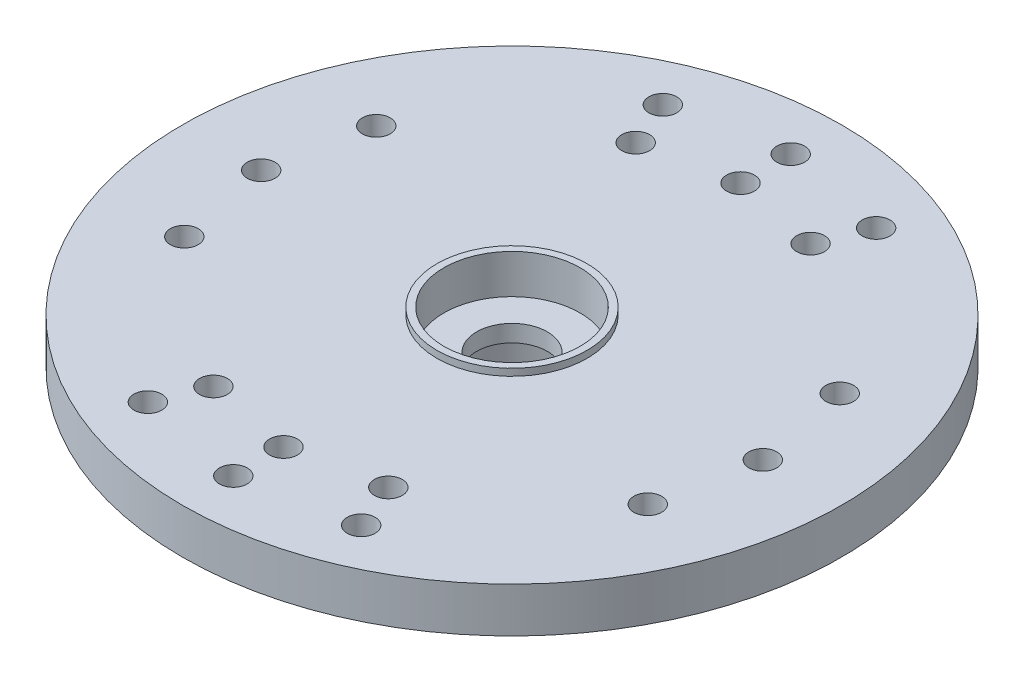
ISO-10303-21;
HEADER;
FILE_DESCRIPTION(('STEP AP214'),'2;1');
FILE_NAME('part.step','',(''),(''),'','','');
FILE_SCHEMA(('AUTOMOTIVE_DESIGN { 1 0 10303 214 1 1 1 1 }'));
ENDSEC;
DATA;
#1=APPLICATION_CONTEXT('core data for automotive mechanical design processes');
#2=APPLICATION_PROTOCOL_DEFINITION('international standard','automotive_design',2000,#1);
#3=PRODUCT_CONTEXT('',#1,'mechanical');
#4=PRODUCT('Part','Part','',(#3));
#5=PRODUCT_RELATED_PRODUCT_CATEGORY('part','',(#4));
#6=PRODUCT_DEFINITION_FORMATION('','',#4);
#7=PRODUCT_DEFINITION_CONTEXT('part definition',#1,'design');
#8=PRODUCT_DEFINITION('design','',#6,#7);
#9=PRODUCT_DEFINITION_SHAPE('','',#8);
#10=(LENGTH_UNIT() NAMED_UNIT(*) SI_UNIT(.MILLI.,.METRE.));
#11=(NAMED_UNIT(*) PLANE_ANGLE_UNIT() SI_UNIT($,.RADIAN.));
#12=(NAMED_UNIT(*) SI_UNIT($,.STERADIAN.) SOLID_ANGLE_UNIT());
#13=UNCERTAINTY_MEASURE_WITH_UNIT(LENGTH_MEASURE(1.E-05),#10,'distance_accuracy_value','');
#14=(GEOMETRIC_REPRESENTATION_CONTEXT(3) GLOBAL_UNCERTAINTY_ASSIGNED_CONTEXT((#13)) GLOBAL_UNIT_ASSIGNED_CONTEXT((#10,
#11,#12)) REPRESENTATION_CONTEXT('',''));
#15=CARTESIAN_POINT('',(0.,0.,0.));
#16=DIRECTION('',(0.,0.,1.));
#17=DIRECTION('',(1.,0.,0.));
#18=AXIS2_PLACEMENT_3D('',#15,#16,#17);
#19=CARTESIAN_POINT('',(0.,1.6129,0.));
#20=DIRECTION('',(0.,1.,0.));
#21=DIRECTION('',(0.,0.,1.));
#22=AXIS2_PLACEMENT_3D('',#19,#20,#21);
#23=PLANE('',#22);
#24=CARTESIAN_POINT('',(0.,1.6129,0.));
#25=DIRECTION('',(0.,1.,0.));
#26=DIRECTION('',(0.,0.,1.));
#27=AXIS2_PLACEMENT_3D('',#24,#25,#26);
#28=CIRCLE('',#27,11.825);
#29=CARTESIAN_POINT('',(0.,1.6129,11.825));
#30=VERTEX_POINT('',#29);
#31=EDGE_CURVE('E43',#30,#30,#28,.T.);
#32=ORIENTED_EDGE('',*,*,#31,.T.);
#33=EDGE_LOOP('',(#32));
#34=FACE_BOUND('',#33,.T.);
#35=CARTESIAN_POINT('',(-9.,1.6129,0.));
#36=DIRECTION('',(0.,1.,0.));
#37=DIRECTION('',(0.,0.,1.));
#38=AXIS2_PLACEMENT_3D('',#35,#36,#37);
#39=CIRCLE('',#38,0.500000000000001);
#40=CARTESIAN_POINT('',(-9.,1.6129,0.500000000000001));
#41=VERTEX_POINT('',#40);
#42=EDGE_CURVE('E119',#41,#41,#39,.T.);
#43=ORIENTED_EDGE('',*,*,#42,.F.);
#44=EDGE_LOOP('',(#43));
#45=FACE_BOUND('',#44,.T.);
#46=CARTESIAN_POINT('',(-8.31491579260157,1.6129,-3.44415089128582));
#47=DIRECTION('',(0.,1.,0.));
#48=DIRECTION('',(0.,0.,1.));
#49=AXIS2_PLACEMENT_3D('',#46,#47,#48);
#50=CIRCLE('',#49,0.500000000000001);
#51=CARTESIAN_POINT('',(-8.31491579260157,1.6129,-2.94415089128582));
#52=VERTEX_POINT('',#51);
#53=EDGE_CURVE('E115',#52,#52,#50,.T.);
#54=ORIENTED_EDGE('',*,*,#53,.F.);
#55=EDGE_LOOP('',(#54));
#56=FACE_BOUND('',#55,.T.);
#57=CARTESIAN_POINT('',(-8.31491579260157,1.6129,3.44415089128582));
#58=DIRECTION('',(0.,1.,0.));
#59=DIRECTION('',(0.,0.,1.));
#60=AXIS2_PLACEMENT_3D('',#57,#58,#59);
#61=CIRCLE('',#60,0.500000000000001);
#62=CARTESIAN_POINT('',(-8.31491579260157,1.6129,3.94415089128582));
#63=VERTEX_POINT('',#62);
#64=EDGE_CURVE('E104',#63,#63,#61,.T.);
#65=ORIENTED_EDGE('',*,*,#64,.F.);
#66=EDGE_LOOP('',(#65));
#67=FACE_BOUND('',#66,.T.);
#68=CARTESIAN_POINT('',(9.,1.6129,0.));
#69=DIRECTION('',(0.,-1.,0.));
#70=DIRECTION('',(0.,0.,1.));
#71=AXIS2_PLACEMENT_3D('',#68,#69,#70);
#72=CIRCLE('',#71,0.500000000000001);
#73=CARTESIAN_POINT('',(9.,1.6129,0.500000000000001));
#74=VERTEX_POINT('',#73);
#75=EDGE_CURVE('E111',#74,#74,#72,.T.);
#76=ORIENTED_EDGE('',*,*,#75,.T.);
#77=EDGE_LOOP('',(#76));
#78=FACE_BOUND('',#77,.T.);
#79=CARTESIAN_POINT('',(8.31491579260157,1.6129,-3.44415089128582));
#80=DIRECTION('',(0.,-1.,0.));
#81=DIRECTION('',(0.,0.,1.));
#82=AXIS2_PLACEMENT_3D('',#79,#80,#81);
#83=CIRCLE('',#82,0.500000000000001);
#84=CARTESIAN_POINT('',(8.31491579260157,1.6129,-2.94415089128582));
#85=VERTEX_POINT('',#84);
#86=EDGE_CURVE('E136',#85,#85,#83,.T.);
#87=ORIENTED_EDGE('',*,*,#86,.T.);
#88=EDGE_LOOP('',(#87));
#89=FACE_BOUND('',#88,.T.);
#90=CARTESIAN_POINT('',(8.31491579260157,1.6129,3.44415089128582));
#91=DIRECTION('',(0.,-1.,0.));
#92=DIRECTION('',(0.,0.,1.));
#93=AXIS2_PLACEMENT_3D('',#90,#91,#92);
#94=CIRCLE('',#93,0.500000000000001);
#95=CARTESIAN_POINT('',(8.31491579260157,1.6129,3.94415089128582));
#96=VERTEX_POINT('',#95);
#97=EDGE_CURVE('E96',#96,#96,#94,.T.);
#98=ORIENTED_EDGE('',*,*,#97,.T.);
#99=EDGE_LOOP('',(#98));
#100=FACE_BOUND('',#99,.T.);
#101=CARTESIAN_POINT('',(0.,1.6129,-10.));
#102=DIRECTION('',(0.,1.,0.));
#103=DIRECTION('',(0.,0.,1.));
#104=AXIS2_PLACEMENT_3D('',#101,#102,#103);
#105=CIRCLE('',#104,0.5);
#106=CARTESIAN_POINT('',(0.,1.6129,-9.5));
#107=VERTEX_POINT('',#106);
#108=EDGE_CURVE('E82',#107,#107,#105,.T.);
#109=ORIENTED_EDGE('',*,*,#108,.F.);
#110=EDGE_LOOP('',(#109));
#111=FACE_BOUND('',#110,.T.);
#112=CARTESIAN_POINT('',(0.,1.6129,-8.2));
#113=DIRECTION('',(0.,1.,0.));
#114=DIRECTION('',(0.,0.,1.));
#115=AXIS2_PLACEMENT_3D('',#112,#113,#114);
#116=CIRCLE('',#115,0.5);
#117=CARTESIAN_POINT('',(0.,1.6129,-7.7));
#118=VERTEX_POINT('',#117);
#119=EDGE_CURVE('E100',#118,#118,#116,.T.);
#120=ORIENTED_EDGE('',*,*,#119,.F.);
#121=EDGE_LOOP('',(#120));
#122=FACE_BOUND('',#121,.T.);
#123=CARTESIAN_POINT('',(-3.13800414539374,1.6129,-7.57581216659255));
#124=DIRECTION('',(0.,1.,0.));
#125=DIRECTION('',(0.382683432365091,0.,0.923879532511287));
#126=AXIS2_PLACEMENT_3D('',#123,#124,#125);
#127=CIRCLE('',#126,0.5);
#128=CARTESIAN_POINT('',(-2.9466624292112,1.6129,-7.11387240033691));
#129=VERTEX_POINT('',#128);
#130=EDGE_CURVE('E92',#129,#129,#127,.T.);
#131=ORIENTED_EDGE('',*,*,#130,.F.);
#132=EDGE_LOOP('',(#131));
#133=FACE_BOUND('',#132,.T.);
#134=CARTESIAN_POINT('',(3.82683432365091,1.6129,-9.23879532511287));
#135=DIRECTION('',(0.,1.,0.));
#136=DIRECTION('',(-0.382683432365091,0.,0.923879532511287));
#137=AXIS2_PLACEMENT_3D('',#134,#135,#136);
#138=CIRCLE('',#137,0.5);
#139=CARTESIAN_POINT('',(3.63549260746836,1.6129,-8.77685555885722));
#140=VERTEX_POINT('',#139);
#141=EDGE_CURVE('E62',#140,#140,#138,.T.);
#142=ORIENTED_EDGE('',*,*,#141,.F.);
#143=EDGE_LOOP('',(#142));
#144=FACE_BOUND('',#143,.T.);
#145=CARTESIAN_POINT('',(3.13800414539374,1.6129,-7.57581216659255));
#146=DIRECTION('',(0.,1.,0.));
#147=DIRECTION('',(-0.382683432365091,0.,0.923879532511287));
#148=AXIS2_PLACEMENT_3D('',#145,#146,#147);
#149=CIRCLE('',#148,0.5);
#150=CARTESIAN_POINT('',(2.9466624292112,1.6129,-7.11387240033691));
#151=VERTEX_POINT('',#150);
#152=EDGE_CURVE('E148',#151,#151,#149,.T.);
#153=ORIENTED_EDGE('',*,*,#152,.F.);
#154=EDGE_LOOP('',(#153));
#155=FACE_BOUND('',#154,.T.);
#156=CARTESIAN_POINT('',(-3.82683432365091,1.6129,-9.23879532511287));
#157=DIRECTION('',(0.,1.,0.));
#158=DIRECTION('',(0.382683432365091,0.,0.923879532511287));
#159=AXIS2_PLACEMENT_3D('',#156,#157,#158);
#160=CIRCLE('',#159,0.5);
#161=CARTESIAN_POINT('',(-3.63549260746836,1.6129,-8.77685555885722));
#162=VERTEX_POINT('',#161);
#163=EDGE_CURVE('E147',#162,#162,#160,.T.);
#164=ORIENTED_EDGE('',*,*,#163,.F.);
#165=EDGE_LOOP('',(#164));
#166=FACE_BOUND('',#165,.T.);
#167=CARTESIAN_POINT('',(0.,1.6129,8.2));
#168=DIRECTION('',(0.,-1.,0.));
#169=DIRECTION('',(0.,0.,-1.));
#170=AXIS2_PLACEMENT_3D('',#167,#168,#169);
#171=CIRCLE('',#170,0.5);
#172=CARTESIAN_POINT('',(0.,1.6129,7.7));
#173=VERTEX_POINT('',#172);
#174=EDGE_CURVE('E78',#173,#173,#171,.T.);
#175=ORIENTED_EDGE('',*,*,#174,.T.);
#176=EDGE_LOOP('',(#175));
#177=FACE_BOUND('',#176,.T.);
#178=CARTESIAN_POINT('',(3.82683432365091,1.6129,9.23879532511287));
#179=DIRECTION('',(0.,-1.,0.));
#180=DIRECTION('',(-0.382683432365091,0.,-0.923879532511287));
#181=AXIS2_PLACEMENT_3D('',#178,#179,#180);
#182=CIRCLE('',#181,0.5);
#183=CARTESIAN_POINT('',(3.63549260746836,1.6129,8.77685555885722));
#184=VERTEX_POINT('',#183);
#185=EDGE_CURVE('E58',#184,#184,#182,.T.);
#186=ORIENTED_EDGE('',*,*,#185,.T.);
#187=EDGE_LOOP('',(#186));
#188=FACE_BOUND('',#187,.T.);
#189=CARTESIAN_POINT('',(0.,1.6129,10.));
#190=DIRECTION('',(0.,-1.,0.));
#191=DIRECTION('',(0.,0.,-1.));
#192=AXIS2_PLACEMENT_3D('',#189,#190,#191);
#193=CIRCLE('',#192,0.5);
#194=CARTESIAN_POINT('',(0.,1.6129,9.5));
#195=VERTEX_POINT('',#194);
#196=EDGE_CURVE('E157',#195,#195,#193,.T.);
#197=ORIENTED_EDGE('',*,*,#196,.T.);
#198=EDGE_LOOP('',(#197));
#199=FACE_BOUND('',#198,.T.);
#200=CARTESIAN_POINT('',(-3.13800414539374,1.6129,7.57581216659255));
#201=DIRECTION('',(0.,-1.,0.));
#202=DIRECTION('',(0.382683432365091,0.,-0.923879532511287));
#203=AXIS2_PLACEMENT_3D('',#200,#201,#202);
#204=CIRCLE('',#203,0.5);
#205=CARTESIAN_POINT('',(-2.9466624292112,1.6129,7.11387240033691));
#206=VERTEX_POINT('',#205);
#207=EDGE_CURVE('E158',#206,#206,#204,.T.);
#208=ORIENTED_EDGE('',*,*,#207,.T.);
#209=EDGE_LOOP('',(#208));
#210=FACE_BOUND('',#209,.T.);
#211=CARTESIAN_POINT('',(-3.82683432365091,1.6129,9.23879532511287));
#212=DIRECTION('',(0.,-1.,0.));
#213=DIRECTION('',(0.382683432365091,0.,-0.923879532511287));
#214=AXIS2_PLACEMENT_3D('',#211,#212,#213);
#215=CIRCLE('',#214,0.5);
#216=CARTESIAN_POINT('',(-3.63549260746836,1.6129,8.77685555885722));
#217=VERTEX_POINT('',#216);
#218=EDGE_CURVE('E161',#217,#217,#215,.T.);
#219=ORIENTED_EDGE('',*,*,#218,.T.);
#220=EDGE_LOOP('',(#219));
#221=FACE_BOUND('',#220,.T.);
#222=CARTESIAN_POINT('',(3.13800414539374,1.6129,7.57581216659255));
#223=DIRECTION('',(0.,-1.,0.));
#224=DIRECTION('',(-0.382683432365091,0.,-0.923879532511287));
#225=AXIS2_PLACEMENT_3D('',#222,#223,#224);
#226=CIRCLE('',#225,0.5);
#227=CARTESIAN_POINT('',(2.9466624292112,1.6129,7.11387240033691));
#228=VERTEX_POINT('',#227);
#229=EDGE_CURVE('E164',#228,#228,#226,.T.);
#230=ORIENTED_EDGE('',*,*,#229,.T.);
#231=EDGE_LOOP('',(#230));
#232=FACE_BOUND('',#231,.T.);
#233=CARTESIAN_POINT('',(0.,1.6129,0.));
#234=DIRECTION('',(0.,1.,0.));
#235=DIRECTION('',(0.,0.,1.));
#236=AXIS2_PLACEMENT_3D('',#233,#234,#235);
#237=CIRCLE('',#236,2.69475);
#238=CARTESIAN_POINT('',(0.,1.6129,2.69475));
#239=VERTEX_POINT('',#238);
#240=EDGE_CURVE('E179',#239,#239,#237,.T.);
#241=ORIENTED_EDGE('',*,*,#240,.F.);
#242=EDGE_LOOP('',(#241));
#243=FACE_BOUND('',#242,.T.);
#244=ADVANCED_FACE('F32',(#34,#45,#56,#67,#78,#89,#100,#111,#122,#133,#144,#155,#166,#177,#188,
#199,#210,#221,#232,#243),#23,.T.);
#245=CARTESIAN_POINT('',(0.,-2.4871,0.));
#246=DIRECTION('',(0.,1.,0.));
#247=DIRECTION('',(0.,0.,1.));
#248=AXIS2_PLACEMENT_3D('',#245,#246,#247);
#249=CYLINDRICAL_SURFACE('',#248,1.27);
#250=CARTESIAN_POINT('',(0.,0.4572,0.));
#251=DIRECTION('',(0.,1.,0.));
#252=DIRECTION('',(0.,0.,1.));
#253=AXIS2_PLACEMENT_3D('',#250,#251,#252);
#254=CIRCLE('',#253,1.27);
#255=CARTESIAN_POINT('',(0.,0.4572,1.27));
#256=VERTEX_POINT('',#255);
#257=EDGE_CURVE('E55',#256,#256,#254,.F.);
#258=ORIENTED_EDGE('',*,*,#257,.F.);
#259=EDGE_LOOP('',(#258));
#260=FACE_BOUND('',#259,.T.);
#261=CARTESIAN_POINT('',(0.,-0.150299999999999,0.));
#262=DIRECTION('',(0.,-1.,0.));
#263=DIRECTION('',(0.,0.,-1.));
#264=AXIS2_PLACEMENT_3D('',#261,#262,#263);
#265=CIRCLE('',#264,1.27);
#266=CARTESIAN_POINT('',(0.,-0.150299999999999,-1.27));
#267=VERTEX_POINT('',#266);
#268=EDGE_CURVE('E50',#267,#267,#265,.F.);
#269=ORIENTED_EDGE('',*,*,#268,.F.);
#270=EDGE_LOOP('',(#269));
#271=FACE_BOUND('',#270,.T.);
#272=ADVANCED_FACE('F206',(#260,#271),#249,.F.);
#273=CARTESIAN_POINT('',(0.,1.6129,0.));
#274=DIRECTION('',(0.,-1.,0.));
#275=DIRECTION('',(0.,0.,-1.));
#276=AXIS2_PLACEMENT_3D('',#273,#274,#275);
#277=CYLINDRICAL_SURFACE('',#276,11.825);
#278=ORIENTED_EDGE('',*,*,#31,.F.);
#279=EDGE_LOOP('',(#278));
#280=FACE_BOUND('',#279,.T.);
#281=CARTESIAN_POINT('',(0.,0.,0.));
#282=DIRECTION('',(0.,1.,0.));
#283=DIRECTION('',(0.,0.,1.));
#284=AXIS2_PLACEMENT_3D('',#281,#282,#283);
#285=CIRCLE('',#284,11.825);
#286=CARTESIAN_POINT('',(0.,0.,11.825));
#287=VERTEX_POINT('',#286);
#288=EDGE_CURVE('E47',#287,#287,#285,.T.);
#289=ORIENTED_EDGE('',*,*,#288,.T.);
#290=EDGE_LOOP('',(#289));
#291=FACE_BOUND('',#290,.T.);
#292=ADVANCED_FACE('F212',(#280,#291),#277,.T.);
#293=CARTESIAN_POINT('',(0.,0.,0.));
#294=DIRECTION('',(0.,1.,0.));
#295=DIRECTION('',(0.,0.,1.));
#296=AXIS2_PLACEMENT_3D('',#293,#294,#295);
#297=PLANE('',#296);
#298=CARTESIAN_POINT('',(0.,0.,0.));
#299=DIRECTION('',(0.,1.,0.));
#300=DIRECTION('',(0.,0.,1.));
#301=AXIS2_PLACEMENT_3D('',#298,#299,#300);
#302=CIRCLE('',#301,3.9);
#303=CARTESIAN_POINT('',(0.,0.,3.9));
#304=VERTEX_POINT('',#303);
#305=EDGE_CURVE('E39',#304,#304,#302,.T.);
#306=ORIENTED_EDGE('',*,*,#305,.T.);
#307=EDGE_LOOP('',(#306));
#308=FACE_BOUND('',#307,.T.);
#309=CARTESIAN_POINT('',(3.13800414539374,0.,7.57581216659255));
#310=DIRECTION('',(0.,1.,0.));
#311=DIRECTION('',(0.,0.,1.));
#312=AXIS2_PLACEMENT_3D('',#309,#310,#311);
#313=CIRCLE('',#312,0.5);
#314=CARTESIAN_POINT('',(3.13800414539374,0.,8.07581216659255));
#315=VERTEX_POINT('',#314);
#316=EDGE_CURVE('E59',#315,#315,#313,.F.);
#317=ORIENTED_EDGE('',*,*,#316,.F.);
#318=EDGE_LOOP('',(#317));
#319=FACE_BOUND('',#318,.T.);
#320=CARTESIAN_POINT('',(-3.82683432365091,0.,9.23879532511287));
#321=DIRECTION('',(0.,1.,0.));
#322=DIRECTION('',(0.,0.,1.));
#323=AXIS2_PLACEMENT_3D('',#320,#321,#322);
#324=CIRCLE('',#323,0.5);
#325=CARTESIAN_POINT('',(-3.82683432365091,0.,9.73879532511287));
#326=VERTEX_POINT('',#325);
#327=EDGE_CURVE('E63',#326,#326,#324,.F.);
#328=ORIENTED_EDGE('',*,*,#327,.F.);
#329=EDGE_LOOP('',(#328));
#330=FACE_BOUND('',#329,.T.);
#331=CARTESIAN_POINT('',(-3.13800414539374,0.,7.57581216659255));
#332=DIRECTION('',(0.,1.,0.));
#333=DIRECTION('',(0.,0.,1.));
#334=AXIS2_PLACEMENT_3D('',#331,#332,#333);
#335=CIRCLE('',#334,0.5);
#336=CARTESIAN_POINT('',(-3.13800414539374,0.,8.07581216659255));
#337=VERTEX_POINT('',#336);
#338=EDGE_CURVE('E66',#337,#337,#335,.F.);
#339=ORIENTED_EDGE('',*,*,#338,.F.);
#340=EDGE_LOOP('',(#339));
#341=FACE_BOUND('',#340,.T.);
#342=CARTESIAN_POINT('',(0.,0.,10.));
#343=DIRECTION('',(0.,1.,0.));
#344=DIRECTION('',(0.,0.,1.));
#345=AXIS2_PLACEMENT_3D('',#342,#343,#344);
#346=CIRCLE('',#345,0.5);
#347=CARTESIAN_POINT('',(0.,0.,10.5));
#348=VERTEX_POINT('',#347);
#349=EDGE_CURVE('E69',#348,#348,#346,.F.);
#350=ORIENTED_EDGE('',*,*,#349,.F.);
#351=EDGE_LOOP('',(#350));
#352=FACE_BOUND('',#351,.T.);
#353=CARTESIAN_POINT('',(3.82683432365091,0.,9.23879532511287));
#354=DIRECTION('',(0.,1.,0.));
#355=DIRECTION('',(0.,0.,1.));
#356=AXIS2_PLACEMENT_3D('',#353,#354,#355);
#357=CIRCLE('',#356,0.5);
#358=CARTESIAN_POINT('',(3.82683432365091,0.,9.73879532511287));
#359=VERTEX_POINT('',#358);
#360=EDGE_CURVE('E72',#359,#359,#357,.F.);
#361=ORIENTED_EDGE('',*,*,#360,.F.);
#362=EDGE_LOOP('',(#361));
#363=FACE_BOUND('',#362,.T.);
#364=CARTESIAN_POINT('',(0.,0.,8.2));
#365=DIRECTION('',(0.,1.,0.));
#366=DIRECTION('',(0.,0.,1.));
#367=AXIS2_PLACEMENT_3D('',#364,#365,#366);
#368=CIRCLE('',#367,0.5);
#369=CARTESIAN_POINT('',(0.,0.,8.7));
#370=VERTEX_POINT('',#369);
#371=EDGE_CURVE('E75',#370,#370,#368,.F.);
#372=ORIENTED_EDGE('',*,*,#371,.F.);
#373=EDGE_LOOP('',(#372));
#374=FACE_BOUND('',#373,.T.);
#375=CARTESIAN_POINT('',(-3.82683432365091,0.,-9.23879532511287));
#376=DIRECTION('',(0.,1.,0.));
#377=DIRECTION('',(0.,0.,1.));
#378=AXIS2_PLACEMENT_3D('',#375,#376,#377);
#379=CIRCLE('',#378,0.5);
#380=CARTESIAN_POINT('',(-3.82683432365091,0.,-8.73879532511287));
#381=VERTEX_POINT('',#380);
#382=EDGE_CURVE('E79',#381,#381,#379,.T.);
#383=ORIENTED_EDGE('',*,*,#382,.T.);
#384=EDGE_LOOP('',(#383));
#385=FACE_BOUND('',#384,.T.);
#386=CARTESIAN_POINT('',(3.13800414539374,0.,-7.57581216659255));
#387=DIRECTION('',(0.,1.,0.));
#388=DIRECTION('',(0.,0.,1.));
#389=AXIS2_PLACEMENT_3D('',#386,#387,#388);
#390=CIRCLE('',#389,0.5);
#391=CARTESIAN_POINT('',(3.13800414539374,0.,-7.07581216659255));
#392=VERTEX_POINT('',#391);
#393=EDGE_CURVE('E83',#392,#392,#390,.T.);
#394=ORIENTED_EDGE('',*,*,#393,.T.);
#395=EDGE_LOOP('',(#394));
#396=FACE_BOUND('',#395,.T.);
#397=CARTESIAN_POINT('',(3.82683432365091,0.,-9.23879532511287));
#398=DIRECTION('',(0.,1.,0.));
#399=DIRECTION('',(0.,0.,1.));
#400=AXIS2_PLACEMENT_3D('',#397,#398,#399);
#401=CIRCLE('',#400,0.5);
#402=CARTESIAN_POINT('',(3.82683432365091,0.,-8.73879532511287));
#403=VERTEX_POINT('',#402);
#404=EDGE_CURVE('E86',#403,#403,#401,.T.);
#405=ORIENTED_EDGE('',*,*,#404,.T.);
#406=EDGE_LOOP('',(#405));
#407=FACE_BOUND('',#406,.T.);
#408=CARTESIAN_POINT('',(-3.13800414539374,0.,-7.57581216659255));
#409=DIRECTION('',(0.,1.,0.));
#410=DIRECTION('',(0.,0.,1.));
#411=AXIS2_PLACEMENT_3D('',#408,#409,#410);
#412=CIRCLE('',#411,0.5);
#413=CARTESIAN_POINT('',(-3.13800414539374,0.,-7.07581216659255));
#414=VERTEX_POINT('',#413);
#415=EDGE_CURVE('E89',#414,#414,#412,.T.);
#416=ORIENTED_EDGE('',*,*,#415,.T.);
#417=EDGE_LOOP('',(#416));
#418=FACE_BOUND('',#417,.T.);
#419=CARTESIAN_POINT('',(0.,0.,-8.2));
#420=DIRECTION('',(0.,1.,0.));
#421=DIRECTION('',(0.,0.,1.));
#422=AXIS2_PLACEMENT_3D('',#419,#420,#421);
#423=CIRCLE('',#422,0.5);
#424=CARTESIAN_POINT('',(0.,0.,-7.7));
#425=VERTEX_POINT('',#424);
#426=EDGE_CURVE('E93',#425,#425,#423,.T.);
#427=ORIENTED_EDGE('',*,*,#426,.T.);
#428=EDGE_LOOP('',(#427));
#429=FACE_BOUND('',#428,.T.);
#430=CARTESIAN_POINT('',(0.,0.,-10.));
#431=DIRECTION('',(0.,1.,0.));
#432=DIRECTION('',(0.,0.,1.));
#433=AXIS2_PLACEMENT_3D('',#430,#431,#432);
#434=CIRCLE('',#433,0.5);
#435=CARTESIAN_POINT('',(0.,0.,-9.5));
#436=VERTEX_POINT('',#435);
#437=EDGE_CURVE('E97',#436,#436,#434,.T.);
#438=ORIENTED_EDGE('',*,*,#437,.T.);
#439=EDGE_LOOP('',(#438));
#440=FACE_BOUND('',#439,.T.);
#441=CARTESIAN_POINT('',(8.31491579260157,0.,3.44415089128582));
#442=DIRECTION('',(0.,1.,0.));
#443=DIRECTION('',(0.,0.,1.));
#444=AXIS2_PLACEMENT_3D('',#441,#442,#443);
#445=CIRCLE('',#444,0.500000000000001);
#446=CARTESIAN_POINT('',(8.31491579260157,0.,3.94415089128582));
#447=VERTEX_POINT('',#446);
#448=EDGE_CURVE('E101',#447,#447,#445,.F.);
#449=ORIENTED_EDGE('',*,*,#448,.F.);
#450=EDGE_LOOP('',(#449));
#451=FACE_BOUND('',#450,.T.);
#452=CARTESIAN_POINT('',(8.31491579260157,0.,-3.44415089128582));
#453=DIRECTION('',(0.,1.,0.));
#454=DIRECTION('',(0.,0.,1.));
#455=AXIS2_PLACEMENT_3D('',#452,#453,#454);
#456=CIRCLE('',#455,0.500000000000001);
#457=CARTESIAN_POINT('',(8.31491579260157,0.,-2.94415089128582));
#458=VERTEX_POINT('',#457);
#459=EDGE_CURVE('E105',#458,#458,#456,.F.);
#460=ORIENTED_EDGE('',*,*,#459,.F.);
#461=EDGE_LOOP('',(#460));
#462=FACE_BOUND('',#461,.T.);
#463=CARTESIAN_POINT('',(9.,0.,0.));
#464=DIRECTION('',(0.,1.,0.));
#465=DIRECTION('',(0.,0.,1.));
#466=AXIS2_PLACEMENT_3D('',#463,#464,#465);
#467=CIRCLE('',#466,0.500000000000001);
#468=CARTESIAN_POINT('',(9.,0.,0.500000000000001));
#469=VERTEX_POINT('',#468);
#470=EDGE_CURVE('E108',#469,#469,#467,.F.);
#471=ORIENTED_EDGE('',*,*,#470,.F.);
#472=EDGE_LOOP('',(#471));
#473=FACE_BOUND('',#472,.T.);
#474=CARTESIAN_POINT('',(-8.31491579260157,0.,3.44415089128582));
#475=DIRECTION('',(0.,1.,0.));
#476=DIRECTION('',(0.,0.,1.));
#477=AXIS2_PLACEMENT_3D('',#474,#475,#476);
#478=CIRCLE('',#477,0.500000000000001);
#479=CARTESIAN_POINT('',(-8.31491579260157,0.,3.94415089128582));
#480=VERTEX_POINT('',#479);
#481=EDGE_CURVE('E112',#480,#480,#478,.T.);
#482=ORIENTED_EDGE('',*,*,#481,.T.);
#483=EDGE_LOOP('',(#482));
#484=FACE_BOUND('',#483,.T.);
#485=CARTESIAN_POINT('',(-8.31491579260157,0.,-3.44415089128582));
#486=DIRECTION('',(0.,1.,0.));
#487=DIRECTION('',(0.,0.,1.));
#488=AXIS2_PLACEMENT_3D('',#485,#486,#487);
#489=CIRCLE('',#488,0.500000000000001);
#490=CARTESIAN_POINT('',(-8.31491579260157,0.,-2.94415089128582));
#491=VERTEX_POINT('',#490);
#492=EDGE_CURVE('E116',#491,#491,#489,.T.);
#493=ORIENTED_EDGE('',*,*,#492,.T.);
#494=EDGE_LOOP('',(#493));
#495=FACE_BOUND('',#494,.T.);
#496=CARTESIAN_POINT('',(-9.,0.,0.));
#497=DIRECTION('',(0.,1.,0.));
#498=DIRECTION('',(0.,0.,1.));
#499=AXIS2_PLACEMENT_3D('',#496,#497,#498);
#500=CIRCLE('',#499,0.500000000000001);
#501=CARTESIAN_POINT('',(-9.,0.,0.500000000000001));
#502=VERTEX_POINT('',#501);
#503=EDGE_CURVE('E120',#502,#502,#500,.T.);
#504=ORIENTED_EDGE('',*,*,#503,.T.);
#505=EDGE_LOOP('',(#504));
#506=FACE_BOUND('',#505,.T.);
#507=ORIENTED_EDGE('',*,*,#288,.F.);
#508=EDGE_LOOP('',(#507));
#509=FACE_BOUND('',#508,.T.);
#510=ADVANCED_FACE('F220',(#308,#319,#330,#341,#352,#363,#374,#385,#396,#407,#418,#429,#440,
#451,#462,#473,#484,#495,#506,#509),#297,.F.);
#511=CARTESIAN_POINT('',(0.,-2.4871,0.));
#512=DIRECTION('',(0.,1.,0.));
#513=DIRECTION('',(0.,0.,1.));
#514=AXIS2_PLACEMENT_3D('',#511,#512,#513);
#515=CYLINDRICAL_SURFACE('',#514,3.4);
#516=CARTESIAN_POINT('',(0.,-0.5,0.));
#517=DIRECTION('',(0.,1.,0.));
#518=DIRECTION('',(0.,0.,1.));
#519=AXIS2_PLACEMENT_3D('',#516,#517,#518);
#520=CIRCLE('',#519,3.4);
#521=CARTESIAN_POINT('',(0.,-0.5,3.4));
#522=VERTEX_POINT('',#521);
#523=EDGE_CURVE('E10',#522,#522,#520,.F.);
#524=ORIENTED_EDGE('',*,*,#523,.T.);
#525=EDGE_LOOP('',(#524));
#526=FACE_BOUND('',#525,.T.);
#527=CARTESIAN_POINT('',(0.,-2.4871,0.));
#528=DIRECTION('',(0.,1.,0.));
#529=DIRECTION('',(0.,0.,1.));
#530=AXIS2_PLACEMENT_3D('',#527,#528,#529);
#531=CIRCLE('',#530,3.4);
#532=CARTESIAN_POINT('',(0.,-2.4871,3.4));
#533=VERTEX_POINT('',#532);
#534=EDGE_CURVE('E123',#533,#533,#531,.T.);
#535=ORIENTED_EDGE('',*,*,#534,.T.);
#536=EDGE_LOOP('',(#535));
#537=FACE_BOUND('',#536,.T.);
#538=ADVANCED_FACE('F218',(#526,#537),#515,.T.);
#539=CARTESIAN_POINT('',(0.,-2.4871,0.));
#540=DIRECTION('',(0.,1.,0.));
#541=DIRECTION('',(0.,0.,1.));
#542=AXIS2_PLACEMENT_3D('',#539,#540,#541);
#543=PLANE('',#542);
#544=CARTESIAN_POINT('',(0.,-2.4871,0.));
#545=DIRECTION('',(0.,-1.,0.));
#546=DIRECTION('',(0.,0.,-1.));
#547=AXIS2_PLACEMENT_3D('',#544,#545,#546);
#548=CIRCLE('',#547,2.286);
#549=CARTESIAN_POINT('',(0.,-2.4871,-2.286));
#550=VERTEX_POINT('',#549);
#551=EDGE_CURVE('E175',#550,#550,#548,.T.);
#552=ORIENTED_EDGE('',*,*,#551,.F.);
#553=EDGE_LOOP('',(#552));
#554=FACE_BOUND('',#553,.T.);
#555=ORIENTED_EDGE('',*,*,#534,.F.);
#556=EDGE_LOOP('',(#555));
#557=FACE_BOUND('',#556,.T.);
#558=ADVANCED_FACE('F244',(#554,#557),#543,.F.);
#559=CARTESIAN_POINT('',(-9.,-2.4871,0.));
#560=DIRECTION('',(0.,1.,0.));
#561=DIRECTION('',(0.,0.,1.));
#562=AXIS2_PLACEMENT_3D('',#559,#560,#561);
#563=CYLINDRICAL_SURFACE('',#562,0.500000000000001);
#564=ORIENTED_EDGE('',*,*,#42,.T.);
#565=EDGE_LOOP('',(#564));
#566=FACE_BOUND('',#565,.T.);
#567=ORIENTED_EDGE('',*,*,#503,.F.);
#568=EDGE_LOOP('',(#567));
#569=FACE_BOUND('',#568,.T.);
#570=ADVANCED_FACE('F251',(#566,#569),#563,.F.);
#571=CARTESIAN_POINT('',(-8.31491579260157,-2.4871,-3.44415089128582));
#572=DIRECTION('',(0.,1.,0.));
#573=DIRECTION('',(0.,0.,1.));
#574=AXIS2_PLACEMENT_3D('',#571,#572,#573);
#575=CYLINDRICAL_SURFACE('',#574,0.500000000000001);
#576=ORIENTED_EDGE('',*,*,#53,.T.);
#577=EDGE_LOOP('',(#576));
#578=FACE_BOUND('',#577,.T.);
#579=ORIENTED_EDGE('',*,*,#492,.F.);
#580=EDGE_LOOP('',(#579));
#581=FACE_BOUND('',#580,.T.);
#582=ADVANCED_FACE('F258',(#578,#581),#575,.F.);
#583=CARTESIAN_POINT('',(-8.31491579260157,-2.4871,3.44415089128582));
#584=DIRECTION('',(0.,1.,0.));
#585=DIRECTION('',(0.,0.,1.));
#586=AXIS2_PLACEMENT_3D('',#583,#584,#585);
#587=CYLINDRICAL_SURFACE('',#586,0.500000000000001);
#588=ORIENTED_EDGE('',*,*,#64,.T.);
#589=EDGE_LOOP('',(#588));
#590=FACE_BOUND('',#589,.T.);
#591=ORIENTED_EDGE('',*,*,#481,.F.);
#592=EDGE_LOOP('',(#591));
#593=FACE_BOUND('',#592,.T.);
#594=ADVANCED_FACE('F266',(#590,#593),#587,.F.);
#595=CARTESIAN_POINT('',(9.,-2.4871,0.));
#596=DIRECTION('',(0.,1.,0.));
#597=DIRECTION('',(0.,0.,1.));
#598=AXIS2_PLACEMENT_3D('',#595,#596,#597);
#599=CYLINDRICAL_SURFACE('',#598,0.500000000000001);
#600=ORIENTED_EDGE('',*,*,#75,.F.);
#601=EDGE_LOOP('',(#600));
#602=FACE_BOUND('',#601,.T.);
#603=ORIENTED_EDGE('',*,*,#470,.T.);
#604=EDGE_LOOP('',(#603));
#605=FACE_BOUND('',#604,.T.);
#606=ADVANCED_FACE('F274',(#602,#605),#599,.F.);
#607=CARTESIAN_POINT('',(8.31491579260157,-2.4871,-3.44415089128582));
#608=DIRECTION('',(0.,1.,0.));
#609=DIRECTION('',(0.,0.,1.));
#610=AXIS2_PLACEMENT_3D('',#607,#608,#609);
#611=CYLINDRICAL_SURFACE('',#610,0.500000000000001);
#612=ORIENTED_EDGE('',*,*,#86,.F.);
#613=EDGE_LOOP('',(#612));
#614=FACE_BOUND('',#613,.T.);
#615=ORIENTED_EDGE('',*,*,#459,.T.);
#616=EDGE_LOOP('',(#615));
#617=FACE_BOUND('',#616,.T.);
#618=ADVANCED_FACE('F283',(#614,#617),#611,.F.);
#619=CARTESIAN_POINT('',(8.31491579260157,-2.4871,3.44415089128582));
#620=DIRECTION('',(0.,1.,0.));
#621=DIRECTION('',(0.,0.,1.));
#622=AXIS2_PLACEMENT_3D('',#619,#620,#621);
#623=CYLINDRICAL_SURFACE('',#622,0.500000000000001);
#624=ORIENTED_EDGE('',*,*,#97,.F.);
#625=EDGE_LOOP('',(#624));
#626=FACE_BOUND('',#625,.T.);
#627=ORIENTED_EDGE('',*,*,#448,.T.);
#628=EDGE_LOOP('',(#627));
#629=FACE_BOUND('',#628,.T.);
#630=ADVANCED_FACE('F290',(#626,#629),#623,.F.);
#631=CARTESIAN_POINT('',(0.,-2.4871,-10.));
#632=DIRECTION('',(0.,1.,0.));
#633=DIRECTION('',(0.,0.,1.));
#634=AXIS2_PLACEMENT_3D('',#631,#632,#633);
#635=CYLINDRICAL_SURFACE('',#634,0.5);
#636=ORIENTED_EDGE('',*,*,#108,.T.);
#637=EDGE_LOOP('',(#636));
#638=FACE_BOUND('',#637,.T.);
#639=ORIENTED_EDGE('',*,*,#437,.F.);
#640=EDGE_LOOP('',(#639));
#641=FACE_BOUND('',#640,.T.);
#642=ADVANCED_FACE('F298',(#638,#641),#635,.F.);
#643=CARTESIAN_POINT('',(0.,-2.4871,-8.2));
#644=DIRECTION('',(0.,1.,0.));
#645=DIRECTION('',(0.,0.,1.));
#646=AXIS2_PLACEMENT_3D('',#643,#644,#645);
#647=CYLINDRICAL_SURFACE('',#646,0.5);
#648=ORIENTED_EDGE('',*,*,#119,.T.);
#649=EDGE_LOOP('',(#648));
#650=FACE_BOUND('',#649,.T.);
#651=ORIENTED_EDGE('',*,*,#426,.F.);
#652=EDGE_LOOP('',(#651));
#653=FACE_BOUND('',#652,.T.);
#654=ADVANCED_FACE('F307',(#650,#653),#647,.F.);
#655=CARTESIAN_POINT('',(-3.13800414539374,-2.4871,-7.57581216659255));
#656=DIRECTION('',(0.,1.,0.));
#657=DIRECTION('',(0.,0.,1.));
#658=AXIS2_PLACEMENT_3D('',#655,#656,#657);
#659=CYLINDRICAL_SURFACE('',#658,0.5);
#660=ORIENTED_EDGE('',*,*,#130,.T.);
#661=EDGE_LOOP('',(#660));
#662=FACE_BOUND('',#661,.T.);
#663=ORIENTED_EDGE('',*,*,#415,.F.);
#664=EDGE_LOOP('',(#663));
#665=FACE_BOUND('',#664,.T.);
#666=ADVANCED_FACE('F315',(#662,#665),#659,.F.);
#667=CARTESIAN_POINT('',(3.82683432365091,-2.4871,-9.23879532511287));
#668=DIRECTION('',(0.,1.,0.));
#669=DIRECTION('',(0.,0.,1.));
#670=AXIS2_PLACEMENT_3D('',#667,#668,#669);
#671=CYLINDRICAL_SURFACE('',#670,0.5);
#672=ORIENTED_EDGE('',*,*,#141,.T.);
#673=EDGE_LOOP('',(#672));
#674=FACE_BOUND('',#673,.T.);
#675=ORIENTED_EDGE('',*,*,#404,.F.);
#676=EDGE_LOOP('',(#675));
#677=FACE_BOUND('',#676,.T.);
#678=ADVANCED_FACE('F323',(#674,#677),#671,.F.);
#679=CARTESIAN_POINT('',(3.13800414539374,-2.4871,-7.57581216659255));
#680=DIRECTION('',(0.,1.,0.));
#681=DIRECTION('',(0.,0.,1.));
#682=AXIS2_PLACEMENT_3D('',#679,#680,#681);
#683=CYLINDRICAL_SURFACE('',#682,0.5);
#684=ORIENTED_EDGE('',*,*,#152,.T.);
#685=EDGE_LOOP('',(#684));
#686=FACE_BOUND('',#685,.T.);
#687=ORIENTED_EDGE('',*,*,#393,.F.);
#688=EDGE_LOOP('',(#687));
#689=FACE_BOUND('',#688,.T.);
#690=ADVANCED_FACE('F331',(#686,#689),#683,.F.);
#691=CARTESIAN_POINT('',(-3.82683432365091,-2.4871,-9.23879532511287));
#692=DIRECTION('',(0.,1.,0.));
#693=DIRECTION('',(0.,0.,1.));
#694=AXIS2_PLACEMENT_3D('',#691,#692,#693);
#695=CYLINDRICAL_SURFACE('',#694,0.5);
#696=ORIENTED_EDGE('',*,*,#163,.T.);
#697=EDGE_LOOP('',(#696));
#698=FACE_BOUND('',#697,.T.);
#699=ORIENTED_EDGE('',*,*,#382,.F.);
#700=EDGE_LOOP('',(#699));
#701=FACE_BOUND('',#700,.T.);
#702=ADVANCED_FACE('F339',(#698,#701),#695,.F.);
#703=CARTESIAN_POINT('',(0.,-2.4871,8.2));
#704=DIRECTION('',(0.,1.,0.));
#705=DIRECTION('',(0.,0.,1.));
#706=AXIS2_PLACEMENT_3D('',#703,#704,#705);
#707=CYLINDRICAL_SURFACE('',#706,0.5);
#708=ORIENTED_EDGE('',*,*,#174,.F.);
#709=EDGE_LOOP('',(#708));
#710=FACE_BOUND('',#709,.T.);
#711=ORIENTED_EDGE('',*,*,#371,.T.);
#712=EDGE_LOOP('',(#711));
#713=FACE_BOUND('',#712,.T.);
#714=ADVANCED_FACE('F347',(#710,#713),#707,.F.);
#715=CARTESIAN_POINT('',(3.82683432365091,-2.4871,9.23879532511287));
#716=DIRECTION('',(0.,1.,0.));
#717=DIRECTION('',(0.,0.,1.));
#718=AXIS2_PLACEMENT_3D('',#715,#716,#717);
#719=CYLINDRICAL_SURFACE('',#718,0.5);
#720=ORIENTED_EDGE('',*,*,#185,.F.);
#721=EDGE_LOOP('',(#720));
#722=FACE_BOUND('',#721,.T.);
#723=ORIENTED_EDGE('',*,*,#360,.T.);
#724=EDGE_LOOP('',(#723));
#725=FACE_BOUND('',#724,.T.);
#726=ADVANCED_FACE('F355',(#722,#725),#719,.F.);
#727=CARTESIAN_POINT('',(0.,-2.4871,10.));
#728=DIRECTION('',(0.,1.,0.));
#729=DIRECTION('',(0.,0.,1.));
#730=AXIS2_PLACEMENT_3D('',#727,#728,#729);
#731=CYLINDRICAL_SURFACE('',#730,0.5);
#732=ORIENTED_EDGE('',*,*,#196,.F.);
#733=EDGE_LOOP('',(#732));
#734=FACE_BOUND('',#733,.T.);
#735=ORIENTED_EDGE('',*,*,#349,.T.);
#736=EDGE_LOOP('',(#735));
#737=FACE_BOUND('',#736,.T.);
#738=ADVANCED_FACE('F363',(#734,#737),#731,.F.);
#739=CARTESIAN_POINT('',(-3.13800414539374,-2.4871,7.57581216659255));
#740=DIRECTION('',(0.,1.,0.));
#741=DIRECTION('',(0.,0.,1.));
#742=AXIS2_PLACEMENT_3D('',#739,#740,#741);
#743=CYLINDRICAL_SURFACE('',#742,0.5);
#744=ORIENTED_EDGE('',*,*,#207,.F.);
#745=EDGE_LOOP('',(#744));
#746=FACE_BOUND('',#745,.T.);
#747=ORIENTED_EDGE('',*,*,#338,.T.);
#748=EDGE_LOOP('',(#747));
#749=FACE_BOUND('',#748,.T.);
#750=ADVANCED_FACE('F371',(#746,#749),#743,.F.);
#751=CARTESIAN_POINT('',(-3.82683432365091,-2.4871,9.23879532511287));
#752=DIRECTION('',(0.,1.,0.));
#753=DIRECTION('',(0.,0.,1.));
#754=AXIS2_PLACEMENT_3D('',#751,#752,#753);
#755=CYLINDRICAL_SURFACE('',#754,0.5);
#756=ORIENTED_EDGE('',*,*,#218,.F.);
#757=EDGE_LOOP('',(#756));
#758=FACE_BOUND('',#757,.T.);
#759=ORIENTED_EDGE('',*,*,#327,.T.);
#760=EDGE_LOOP('',(#759));
#761=FACE_BOUND('',#760,.T.);
#762=ADVANCED_FACE('F379',(#758,#761),#755,.F.);
#763=CARTESIAN_POINT('',(3.13800414539374,-2.4871,7.57581216659255));
#764=DIRECTION('',(0.,1.,0.));
#765=DIRECTION('',(0.,0.,1.));
#766=AXIS2_PLACEMENT_3D('',#763,#764,#765);
#767=CYLINDRICAL_SURFACE('',#766,0.5);
#768=ORIENTED_EDGE('',*,*,#229,.F.);
#769=EDGE_LOOP('',(#768));
#770=FACE_BOUND('',#769,.T.);
#771=ORIENTED_EDGE('',*,*,#316,.T.);
#772=EDGE_LOOP('',(#771));
#773=FACE_BOUND('',#772,.T.);
#774=ADVANCED_FACE('F387',(#770,#773),#767,.F.);
#775=CARTESIAN_POINT('',(0.,0.4572,0.));
#776=DIRECTION('',(0.,1.,0.));
#777=DIRECTION('',(0.,0.,1.));
#778=AXIS2_PLACEMENT_3D('',#775,#776,#777);
#779=PLANE('',#778);
#780=CARTESIAN_POINT('',(0.,0.4572,0.));
#781=DIRECTION('',(0.,1.,0.));
#782=DIRECTION('',(0.,0.,1.));
#783=AXIS2_PLACEMENT_3D('',#780,#781,#782);
#784=CIRCLE('',#783,2.44475);
#785=CARTESIAN_POINT('',(0.,0.4572,2.44475));
#786=VERTEX_POINT('',#785);
#787=EDGE_CURVE('E53',#786,#786,#784,.T.);
#788=ORIENTED_EDGE('',*,*,#787,.T.);
#789=EDGE_LOOP('',(#788));
#790=FACE_BOUND('',#789,.T.);
#791=ORIENTED_EDGE('',*,*,#257,.T.);
#792=EDGE_LOOP('',(#791));
#793=FACE_BOUND('',#792,.T.);
#794=ADVANCED_FACE('F395',(#790,#793),#779,.T.);
#795=CARTESIAN_POINT('',(0.,0.4572,0.));
#796=DIRECTION('',(0.,1.,0.));
#797=DIRECTION('',(0.,0.,1.));
#798=AXIS2_PLACEMENT_3D('',#795,#796,#797);
#799=CYLINDRICAL_SURFACE('',#798,2.44475);
#800=ORIENTED_EDGE('',*,*,#787,.F.);
#801=EDGE_LOOP('',(#800));
#802=FACE_BOUND('',#801,.T.);
#803=CARTESIAN_POINT('',(0.,1.8629,0.));
#804=DIRECTION('',(0.,1.,0.));
#805=DIRECTION('',(0.,0.,1.));
#806=AXIS2_PLACEMENT_3D('',#803,#804,#805);
#807=CIRCLE('',#806,2.44475);
#808=CARTESIAN_POINT('',(0.,1.8629,2.44475));
#809=VERTEX_POINT('',#808);
#810=EDGE_CURVE('E182',#809,#809,#807,.T.);
#811=ORIENTED_EDGE('',*,*,#810,.T.);
#812=EDGE_LOOP('',(#811));
#813=FACE_BOUND('',#812,.T.);
#814=ADVANCED_FACE('F188',(#802,#813),#799,.F.);
#815=CARTESIAN_POINT('',(0.,-0.150299999999999,0.));
#816=DIRECTION('',(0.,-1.,0.));
#817=DIRECTION('',(0.,0.,-1.));
#818=AXIS2_PLACEMENT_3D('',#815,#816,#817);
#819=PLANE('',#818);
#820=CARTESIAN_POINT('',(0.,-0.150299999999999,0.));
#821=DIRECTION('',(0.,-1.,0.));
#822=DIRECTION('',(0.,0.,-1.));
#823=AXIS2_PLACEMENT_3D('',#820,#821,#822);
#824=CIRCLE('',#823,2.08155649107262);
#825=CARTESIAN_POINT('',(0.,-0.150299999999999,-2.08155649107262));
#826=VERTEX_POINT('',#825);
#827=EDGE_CURVE('E54',#826,#826,#824,.T.);
#828=ORIENTED_EDGE('',*,*,#827,.T.);
#829=EDGE_LOOP('',(#828));
#830=FACE_BOUND('',#829,.T.);
#831=ORIENTED_EDGE('',*,*,#268,.T.);
#832=EDGE_LOOP('',(#831));
#833=FACE_BOUND('',#832,.T.);
#834=ADVANCED_FACE('F202',(#830,#833),#819,.T.);
#835=CARTESIAN_POINT('',(0.,-2.4871,0.));
#836=DIRECTION('',(0.,-1.,0.));
#837=DIRECTION('',(0.,0.,-1.));
#838=AXIS2_PLACEMENT_3D('',#835,#836,#837);
#839=CONICAL_SURFACE('',#838,2.286,0.0872664625997165);
#840=ORIENTED_EDGE('',*,*,#827,.F.);
#841=EDGE_LOOP('',(#840));
#842=FACE_BOUND('',#841,.T.);
#843=ORIENTED_EDGE('',*,*,#551,.T.);
#844=EDGE_LOOP('',(#843));
#845=FACE_BOUND('',#844,.T.);
#846=ADVANCED_FACE('F193',(#842,#845),#839,.F.);
#847=CARTESIAN_POINT('',(0.,1.8629,0.));
#848=DIRECTION('',(0.,1.,0.));
#849=DIRECTION('',(0.,0.,1.));
#850=AXIS2_PLACEMENT_3D('',#847,#848,#849);
#851=PLANE('',#850);
#852=CARTESIAN_POINT('',(0.,1.8629,0.));
#853=DIRECTION('',(0.,1.,0.));
#854=DIRECTION('',(0.,0.,1.));
#855=AXIS2_PLACEMENT_3D('',#852,#853,#854);
#856=CIRCLE('',#855,2.69475);
#857=CARTESIAN_POINT('',(0.,1.8629,2.69475));
#858=VERTEX_POINT('',#857);
#859=EDGE_CURVE('E178',#858,#858,#856,.T.);
#860=ORIENTED_EDGE('',*,*,#859,.T.);
#861=EDGE_LOOP('',(#860));
#862=FACE_BOUND('',#861,.T.);
#863=ORIENTED_EDGE('',*,*,#810,.F.);
#864=EDGE_LOOP('',(#863));
#865=FACE_BOUND('',#864,.T.);
#866=ADVANCED_FACE('F190',(#862,#865),#851,.T.);
#867=CARTESIAN_POINT('',(0.,1.8629,0.));
#868=DIRECTION('',(0.,-1.,0.));
#869=DIRECTION('',(0.,0.,-1.));
#870=AXIS2_PLACEMENT_3D('',#867,#868,#869);
#871=CYLINDRICAL_SURFACE('',#870,2.69475);
#872=ORIENTED_EDGE('',*,*,#859,.F.);
#873=EDGE_LOOP('',(#872));
#874=FACE_BOUND('',#873,.T.);
#875=ORIENTED_EDGE('',*,*,#240,.T.);
#876=EDGE_LOOP('',(#875));
#877=FACE_BOUND('',#876,.T.);
#878=ADVANCED_FACE('F192',(#874,#877),#871,.T.);
#879=CARTESIAN_POINT('',(0.,-0.5,0.));
#880=DIRECTION('',(0.,1.,0.));
#881=DIRECTION('',(0.,0.,1.));
#882=AXIS2_PLACEMENT_3D('',#879,#880,#881);
#883=TOROIDAL_SURFACE('',#882,3.9,0.5);
#884=ORIENTED_EDGE('',*,*,#523,.F.);
#885=EDGE_LOOP('',(#884));
#886=FACE_BOUND('',#885,.T.);
#887=ORIENTED_EDGE('',*,*,#305,.F.);
#888=EDGE_LOOP('',(#887));
#889=FACE_BOUND('',#888,.T.);
#890=ADVANCED_FACE('F34',(#886,#889),#883,.F.);
#891=CLOSED_SHELL('',(#244,#272,#292,#510,#538,#558,#570,#582,#594,#606,#618,#630,#642,#654,
#666,#678,#690,#702,#714,#726,#738,#750,#762,#774,#794,#814,#834,#846,#866,#878,#890));
#892=MANIFOLD_SOLID_BREP('B2',#891);
#893=ADVANCED_BREP_SHAPE_REPRESENTATION('',(#18,#892),#14);
#894=SHAPE_DEFINITION_REPRESENTATION(#9,#893);
ENDSEC;
END-ISO-10303-21;
